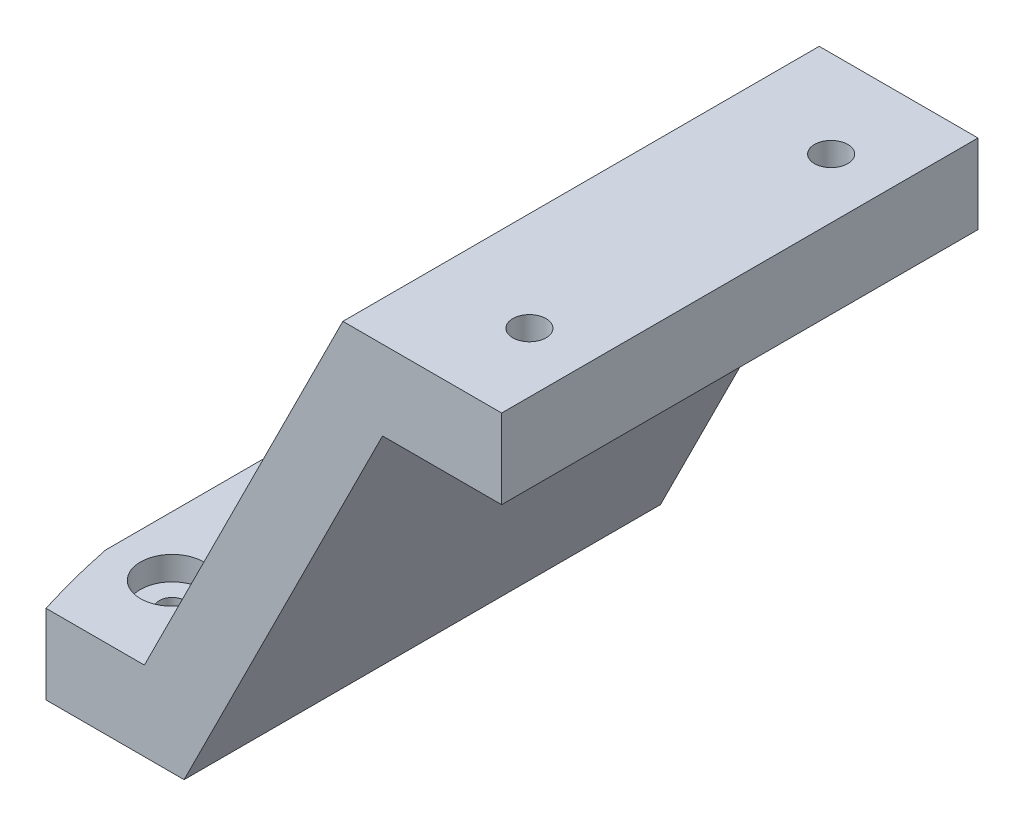
ISO-10303-21;
HEADER;
FILE_DESCRIPTION(('STEP AP214'),'2;1');
FILE_NAME('part.step','',(''),(''),'','','');
FILE_SCHEMA(('AUTOMOTIVE_DESIGN { 1 0 10303 214 1 1 1 1 }'));
ENDSEC;
DATA;
#1=APPLICATION_CONTEXT('core data for automotive mechanical design processes');
#2=APPLICATION_PROTOCOL_DEFINITION('international standard','automotive_design',2000,#1);
#3=PRODUCT_CONTEXT('',#1,'mechanical');
#4=PRODUCT('Part','Part','',(#3));
#5=PRODUCT_RELATED_PRODUCT_CATEGORY('part','',(#4));
#6=PRODUCT_DEFINITION_FORMATION('','',#4);
#7=PRODUCT_DEFINITION_CONTEXT('part definition',#1,'design');
#8=PRODUCT_DEFINITION('design','',#6,#7);
#9=PRODUCT_DEFINITION_SHAPE('','',#8);
#10=(LENGTH_UNIT() NAMED_UNIT(*) SI_UNIT(.MILLI.,.METRE.));
#11=(NAMED_UNIT(*) PLANE_ANGLE_UNIT() SI_UNIT($,.RADIAN.));
#12=(NAMED_UNIT(*) SI_UNIT($,.STERADIAN.) SOLID_ANGLE_UNIT());
#13=UNCERTAINTY_MEASURE_WITH_UNIT(LENGTH_MEASURE(1.E-05),#10,'distance_accuracy_value','');
#14=(GEOMETRIC_REPRESENTATION_CONTEXT(3) GLOBAL_UNCERTAINTY_ASSIGNED_CONTEXT((#13)) GLOBAL_UNIT_ASSIGNED_CONTEXT((#10,
#11,#12)) REPRESENTATION_CONTEXT('',''));
#15=CARTESIAN_POINT('',(0.,0.,0.));
#16=DIRECTION('',(0.,0.,1.));
#17=DIRECTION('',(1.,0.,0.));
#18=AXIS2_PLACEMENT_3D('',#15,#16,#17);
#19=CARTESIAN_POINT('',(-12.5,0.,11.));
#20=DIRECTION('',(0.,1.,0.));
#21=DIRECTION('',(0.,0.,1.));
#22=AXIS2_PLACEMENT_3D('',#19,#20,#21);
#23=CYLINDRICAL_SURFACE('',#22,1.6);
#24=CARTESIAN_POINT('',(-12.5,0.,11.));
#25=DIRECTION('',(0.,1.,0.));
#26=DIRECTION('',(0.,0.,1.));
#27=AXIS2_PLACEMENT_3D('',#24,#25,#26);
#28=CIRCLE('',#27,1.6);
#29=CARTESIAN_POINT('',(-12.5,0.,12.6));
#30=VERTEX_POINT('',#29);
#31=EDGE_CURVE('E300',#30,#30,#28,.T.);
#32=ORIENTED_EDGE('',*,*,#31,.F.);
#33=EDGE_LOOP('',(#32));
#34=FACE_BOUND('',#33,.T.);
#35=CARTESIAN_POINT('',(-12.5,7.,11.));
#36=DIRECTION('',(0.,1.,0.));
#37=DIRECTION('',(0.,0.,1.));
#38=AXIS2_PLACEMENT_3D('',#35,#36,#37);
#39=CIRCLE('',#38,1.6);
#40=CARTESIAN_POINT('',(-12.5,7.,12.6));
#41=VERTEX_POINT('',#40);
#42=EDGE_CURVE('E303',#41,#41,#39,.F.);
#43=ORIENTED_EDGE('',*,*,#42,.F.);
#44=EDGE_LOOP('',(#43));
#45=FACE_BOUND('',#44,.T.);
#46=ADVANCED_FACE('F33',(#34,#45),#23,.F.);
#47=CARTESIAN_POINT('',(-12.5,0.,49.));
#48=DIRECTION('',(0.,1.,0.));
#49=DIRECTION('',(0.,0.,1.));
#50=AXIS2_PLACEMENT_3D('',#47,#48,#49);
#51=CYLINDRICAL_SURFACE('',#50,1.6);
#52=CARTESIAN_POINT('',(-12.5,0.,49.));
#53=DIRECTION('',(0.,1.,0.));
#54=DIRECTION('',(0.,0.,1.));
#55=AXIS2_PLACEMENT_3D('',#52,#53,#54);
#56=CIRCLE('',#55,1.6);
#57=CARTESIAN_POINT('',(-12.5,0.,50.6));
#58=VERTEX_POINT('',#57);
#59=EDGE_CURVE('E296',#58,#58,#56,.T.);
#60=ORIENTED_EDGE('',*,*,#59,.F.);
#61=EDGE_LOOP('',(#60));
#62=FACE_BOUND('',#61,.T.);
#63=CARTESIAN_POINT('',(-12.5,7.,49.));
#64=DIRECTION('',(0.,1.,0.));
#65=DIRECTION('',(0.,0.,1.));
#66=AXIS2_PLACEMENT_3D('',#63,#64,#65);
#67=CIRCLE('',#66,1.6);
#68=CARTESIAN_POINT('',(-12.5,7.,50.6));
#69=VERTEX_POINT('',#68);
#70=EDGE_CURVE('E287',#69,#69,#67,.F.);
#71=ORIENTED_EDGE('',*,*,#70,.F.);
#72=EDGE_LOOP('',(#71));
#73=FACE_BOUND('',#72,.T.);
#74=ADVANCED_FACE('F457',(#62,#73),#51,.F.);
#75=CARTESIAN_POINT('',(-20.,10.,60.));
#76=DIRECTION('',(0.,-1.,0.));
#77=DIRECTION('',(0.,0.,-1.));
#78=AXIS2_PLACEMENT_3D('',#75,#76,#77);
#79=PLANE('',#78);
#80=CARTESIAN_POINT('',(-12.5,10.,49.));
#81=DIRECTION('',(0.,1.,0.));
#82=DIRECTION('',(0.,0.,1.));
#83=AXIS2_PLACEMENT_3D('',#80,#81,#82);
#84=CIRCLE('',#83,4.);
#85=CARTESIAN_POINT('',(-12.5,10.,53.));
#86=VERTEX_POINT('',#85);
#87=EDGE_CURVE('E288',#86,#86,#84,.T.);
#88=ORIENTED_EDGE('',*,*,#87,.F.);
#89=EDGE_LOOP('',(#88));
#90=FACE_BOUND('',#89,.T.);
#91=CARTESIAN_POINT('',(-12.5,10.,11.));
#92=DIRECTION('',(0.,1.,0.));
#93=DIRECTION('',(0.,0.,1.));
#94=AXIS2_PLACEMENT_3D('',#91,#92,#93);
#95=CIRCLE('',#94,4.);
#96=CARTESIAN_POINT('',(-12.5,10.,15.));
#97=VERTEX_POINT('',#96);
#98=EDGE_CURVE('E280',#97,#97,#95,.T.);
#99=ORIENTED_EDGE('',*,*,#98,.F.);
#100=EDGE_LOOP('',(#99));
#101=FACE_BOUND('',#100,.T.);
#102=CARTESIAN_POINT('',(78.,10.,30.));
#103=DIRECTION('',(0.,1.,0.));
#104=DIRECTION('',(0.,0.,1.));
#105=AXIS2_PLACEMENT_3D('',#102,#103,#104);
#106=CIRCLE('',#105,100.);
#107=CARTESIAN_POINT('',(-20.,10.,49.8997487421326));
#108=VERTEX_POINT('',#107);
#109=CARTESIAN_POINT('',(-17.3939201416946,10.,60.));
#110=VERTEX_POINT('',#109);
#111=EDGE_CURVE('E317',#108,#110,#106,.T.);
#112=ORIENTED_EDGE('',*,*,#111,.T.);
#113=DIRECTION('',(-1.,0.,0.));
#114=VECTOR('',#113,1.);
#115=CARTESIAN_POINT('',(-20.,10.,60.));
#116=LINE('',#115,#114);
#117=CARTESIAN_POINT('',(-5.,10.,60.));
#118=VERTEX_POINT('',#117);
#119=EDGE_CURVE('E353',#118,#110,#116,.T.);
#120=ORIENTED_EDGE('',*,*,#119,.F.);
#121=DIRECTION('',(0.,0.,-1.));
#122=VECTOR('',#121,1.);
#123=CARTESIAN_POINT('',(-5.,10.,60.));
#124=LINE('',#123,#122);
#125=CARTESIAN_POINT('',(-5.,10.,0.));
#126=VERTEX_POINT('',#125);
#127=EDGE_CURVE('E381',#118,#126,#124,.T.);
#128=ORIENTED_EDGE('',*,*,#127,.T.);
#129=DIRECTION('',(-1.,0.,0.));
#130=VECTOR('',#129,1.);
#131=CARTESIAN_POINT('',(-20.,10.,0.));
#132=LINE('',#131,#130);
#133=CARTESIAN_POINT('',(-17.3939201416946,10.,0.));
#134=VERTEX_POINT('',#133);
#135=EDGE_CURVE('E369',#126,#134,#132,.T.);
#136=ORIENTED_EDGE('',*,*,#135,.T.);
#137=CARTESIAN_POINT('',(-20.,10.,10.1002512578674));
#138=VERTEX_POINT('',#137);
#139=EDGE_CURVE('E328',#134,#138,#106,.T.);
#140=ORIENTED_EDGE('',*,*,#139,.T.);
#141=DIRECTION('',(0.,0.,-1.));
#142=VECTOR('',#141,1.);
#143=CARTESIAN_POINT('',(-20.,10.,60.));
#144=LINE('',#143,#142);
#145=EDGE_CURVE('E378',#108,#138,#144,.T.);
#146=ORIENTED_EDGE('',*,*,#145,.F.);
#147=EDGE_LOOP('',(#112,#120,#128,#136,#140,#146));
#148=FACE_BOUND('',#147,.T.);
#149=ADVANCED_FACE('F464',(#90,#101,#148),#79,.F.);
#150=CARTESIAN_POINT('',(-20.,0.,60.));
#151=DIRECTION('',(1.,0.,0.));
#152=DIRECTION('',(0.,0.,-1.));
#153=AXIS2_PLACEMENT_3D('',#150,#151,#152);
#154=PLANE('',#153);
#155=DIRECTION('',(0.,1.,0.));
#156=VECTOR('',#155,1.);
#157=CARTESIAN_POINT('',(-20.,-50.,10.1002512578674));
#158=LINE('',#157,#156);
#159=CARTESIAN_POINT('',(-20.,0.,10.1002512578674));
#160=VERTEX_POINT('',#159);
#161=EDGE_CURVE('E333',#160,#138,#158,.T.);
#162=ORIENTED_EDGE('',*,*,#161,.F.);
#163=DIRECTION('',(0.,0.,-1.));
#164=VECTOR('',#163,1.);
#165=CARTESIAN_POINT('',(-20.,0.,60.));
#166=LINE('',#165,#164);
#167=CARTESIAN_POINT('',(-20.,0.,49.8997487421326));
#168=VERTEX_POINT('',#167);
#169=EDGE_CURVE('E375',#168,#160,#166,.T.);
#170=ORIENTED_EDGE('',*,*,#169,.F.);
#171=DIRECTION('',(0.,1.,0.));
#172=VECTOR('',#171,1.);
#173=CARTESIAN_POINT('',(-20.,-50.,49.8997487421326));
#174=LINE('',#173,#172);
#175=EDGE_CURVE('E338',#108,#168,#174,.F.);
#176=ORIENTED_EDGE('',*,*,#175,.F.);
#177=ORIENTED_EDGE('',*,*,#145,.T.);
#178=EDGE_LOOP('',(#162,#170,#176,#177));
#179=FACE_BOUND('',#178,.T.);
#180=ADVANCED_FACE('F509',(#179),#154,.F.);
#181=CARTESIAN_POINT('',(0.,0.,60.));
#182=DIRECTION('',(0.,1.,0.));
#183=DIRECTION('',(-1.,0.,0.));
#184=AXIS2_PLACEMENT_3D('',#181,#182,#183);
#185=PLANE('',#184);
#186=ORIENTED_EDGE('',*,*,#59,.T.);
#187=EDGE_LOOP('',(#186));
#188=FACE_BOUND('',#187,.T.);
#189=ORIENTED_EDGE('',*,*,#31,.T.);
#190=EDGE_LOOP('',(#189));
#191=FACE_BOUND('',#190,.T.);
#192=CARTESIAN_POINT('',(78.,0.,30.));
#193=DIRECTION('',(0.,1.,0.));
#194=DIRECTION('',(-1.,0.,0.));
#195=AXIS2_PLACEMENT_3D('',#192,#193,#194);
#196=CIRCLE('',#195,100.);
#197=CARTESIAN_POINT('',(-17.3939201416946,0.,60.));
#198=VERTEX_POINT('',#197);
#199=EDGE_CURVE('E334',#168,#198,#196,.T.);
#200=ORIENTED_EDGE('',*,*,#199,.F.);
#201=ORIENTED_EDGE('',*,*,#169,.T.);
#202=CARTESIAN_POINT('',(-17.3939201416946,0.,0.));
#203=VERTEX_POINT('',#202);
#204=EDGE_CURVE('E331',#203,#160,#196,.T.);
#205=ORIENTED_EDGE('',*,*,#204,.F.);
#206=DIRECTION('',(1.,0.,0.));
#207=VECTOR('',#206,1.);
#208=CARTESIAN_POINT('',(0.,0.,0.));
#209=LINE('',#208,#207);
#210=CARTESIAN_POINT('',(0.,0.,0.));
#211=VERTEX_POINT('',#210);
#212=EDGE_CURVE('E345',#203,#211,#209,.T.);
#213=ORIENTED_EDGE('',*,*,#212,.T.);
#214=DIRECTION('',(0.,0.,-1.));
#215=VECTOR('',#214,1.);
#216=CARTESIAN_POINT('',(0.,0.,60.));
#217=LINE('',#216,#215);
#218=CARTESIAN_POINT('',(0.,0.,60.));
#219=VERTEX_POINT('',#218);
#220=EDGE_CURVE('E358',#219,#211,#217,.T.);
#221=ORIENTED_EDGE('',*,*,#220,.F.);
#222=DIRECTION('',(1.,0.,0.));
#223=VECTOR('',#222,1.);
#224=CARTESIAN_POINT('',(0.,0.,60.));
#225=LINE('',#224,#223);
#226=EDGE_CURVE('E356',#198,#219,#225,.T.);
#227=ORIENTED_EDGE('',*,*,#226,.F.);
#228=EDGE_LOOP('',(#200,#201,#205,#213,#221,#227));
#229=FACE_BOUND('',#228,.T.);
#230=ADVANCED_FACE('F501',(#188,#191,#229),#185,.F.);
#231=CARTESIAN_POINT('',(0.,0.,60.));
#232=DIRECTION('',(0.,0.,-1.));
#233=DIRECTION('',(-1.,0.,0.));
#234=AXIS2_PLACEMENT_3D('',#231,#232,#233);
#235=PLANE('',#234);
#236=DIRECTION('',(0.,1.,0.));
#237=VECTOR('',#236,1.);
#238=CARTESIAN_POINT('',(-17.3939201416946,-50.,60.));
#239=LINE('',#238,#237);
#240=EDGE_CURVE('E336',#198,#110,#239,.T.);
#241=ORIENTED_EDGE('',*,*,#240,.F.);
#242=ORIENTED_EDGE('',*,*,#226,.T.);
#243=DIRECTION('',(0.447213595499958,0.894427190999916,0.));
#244=VECTOR('',#243,1.);
#245=CARTESIAN_POINT('',(25.,50.,60.));
#246=LINE('',#245,#244);
#247=CARTESIAN_POINT('',(25.,50.,60.));
#248=VERTEX_POINT('',#247);
#249=EDGE_CURVE('E341',#219,#248,#246,.T.);
#250=ORIENTED_EDGE('',*,*,#249,.T.);
#251=DIRECTION('',(1.,0.,0.));
#252=VECTOR('',#251,1.);
#253=CARTESIAN_POINT('',(40.,50.,60.));
#254=LINE('',#253,#252);
#255=CARTESIAN_POINT('',(40.,50.,60.));
#256=VERTEX_POINT('',#255);
#257=EDGE_CURVE('E344',#248,#256,#254,.T.);
#258=ORIENTED_EDGE('',*,*,#257,.T.);
#259=DIRECTION('',(0.,1.,0.));
#260=VECTOR('',#259,1.);
#261=CARTESIAN_POINT('',(40.,60.,60.));
#262=LINE('',#261,#260);
#263=CARTESIAN_POINT('',(40.,60.,60.));
#264=VERTEX_POINT('',#263);
#265=EDGE_CURVE('E347',#256,#264,#262,.T.);
#266=ORIENTED_EDGE('',*,*,#265,.T.);
#267=DIRECTION('',(-1.,0.,0.));
#268=VECTOR('',#267,1.);
#269=CARTESIAN_POINT('',(20.,60.,60.));
#270=LINE('',#269,#268);
#271=CARTESIAN_POINT('',(20.,60.,60.));
#272=VERTEX_POINT('',#271);
#273=EDGE_CURVE('E349',#264,#272,#270,.T.);
#274=ORIENTED_EDGE('',*,*,#273,.T.);
#275=DIRECTION('',(-0.447213595499958,-0.894427190999916,0.));
#276=VECTOR('',#275,1.);
#277=CARTESIAN_POINT('',(-5.,10.,60.));
#278=LINE('',#277,#276);
#279=EDGE_CURVE('E351',#272,#118,#278,.T.);
#280=ORIENTED_EDGE('',*,*,#279,.T.);
#281=ORIENTED_EDGE('',*,*,#119,.T.);
#282=EDGE_LOOP('',(#241,#242,#250,#258,#266,#274,#280,#281));
#283=FACE_BOUND('',#282,.T.);
#284=ADVANCED_FACE('F497',(#283),#235,.F.);
#285=CARTESIAN_POINT('',(0.,0.,0.));
#286=DIRECTION('',(0.,0.,-1.));
#287=DIRECTION('',(-1.,0.,0.));
#288=AXIS2_PLACEMENT_3D('',#285,#286,#287);
#289=PLANE('',#288);
#290=ORIENTED_EDGE('',*,*,#212,.F.);
#291=DIRECTION('',(0.,1.,0.));
#292=VECTOR('',#291,1.);
#293=CARTESIAN_POINT('',(-17.3939201416946,-50.,0.));
#294=LINE('',#293,#292);
#295=EDGE_CURVE('E396',#203,#134,#294,.T.);
#296=ORIENTED_EDGE('',*,*,#295,.T.);
#297=ORIENTED_EDGE('',*,*,#135,.F.);
#298=DIRECTION('',(-0.447213595499958,-0.894427190999916,0.));
#299=VECTOR('',#298,1.);
#300=CARTESIAN_POINT('',(-5.,10.,0.));
#301=LINE('',#300,#299);
#302=CARTESIAN_POINT('',(20.,60.,0.));
#303=VERTEX_POINT('',#302);
#304=EDGE_CURVE('E367',#303,#126,#301,.T.);
#305=ORIENTED_EDGE('',*,*,#304,.F.);
#306=DIRECTION('',(-1.,0.,0.));
#307=VECTOR('',#306,1.);
#308=CARTESIAN_POINT('',(20.,60.,0.));
#309=LINE('',#308,#307);
#310=CARTESIAN_POINT('',(40.,60.,0.));
#311=VERTEX_POINT('',#310);
#312=EDGE_CURVE('E365',#311,#303,#309,.T.);
#313=ORIENTED_EDGE('',*,*,#312,.F.);
#314=DIRECTION('',(0.,1.,0.));
#315=VECTOR('',#314,1.);
#316=CARTESIAN_POINT('',(40.,60.,0.));
#317=LINE('',#316,#315);
#318=CARTESIAN_POINT('',(40.,50.,0.));
#319=VERTEX_POINT('',#318);
#320=EDGE_CURVE('E363',#319,#311,#317,.T.);
#321=ORIENTED_EDGE('',*,*,#320,.F.);
#322=DIRECTION('',(1.,0.,0.));
#323=VECTOR('',#322,1.);
#324=CARTESIAN_POINT('',(40.,50.,0.));
#325=LINE('',#324,#323);
#326=CARTESIAN_POINT('',(25.,50.,0.));
#327=VERTEX_POINT('',#326);
#328=EDGE_CURVE('E361',#327,#319,#325,.T.);
#329=ORIENTED_EDGE('',*,*,#328,.F.);
#330=DIRECTION('',(0.447213595499958,0.894427190999916,0.));
#331=VECTOR('',#330,1.);
#332=CARTESIAN_POINT('',(25.,50.,0.));
#333=LINE('',#332,#331);
#334=EDGE_CURVE('E340',#211,#327,#333,.T.);
#335=ORIENTED_EDGE('',*,*,#334,.F.);
#336=EDGE_LOOP('',(#290,#296,#297,#305,#313,#321,#329,#335));
#337=FACE_BOUND('',#336,.T.);
#338=ADVANCED_FACE('F500',(#337),#289,.T.);
#339=CARTESIAN_POINT('',(25.,50.,60.));
#340=DIRECTION('',(-0.894427190999916,0.447213595499958,0.));
#341=DIRECTION('',(-0.447213595499958,-0.894427190999916,0.));
#342=AXIS2_PLACEMENT_3D('',#339,#340,#341);
#343=PLANE('',#342);
#344=ORIENTED_EDGE('',*,*,#334,.T.);
#345=DIRECTION('',(0.,0.,-1.));
#346=VECTOR('',#345,1.);
#347=CARTESIAN_POINT('',(25.,50.,60.));
#348=LINE('',#347,#346);
#349=EDGE_CURVE('E393',#248,#327,#348,.T.);
#350=ORIENTED_EDGE('',*,*,#349,.F.);
#351=ORIENTED_EDGE('',*,*,#249,.F.);
#352=ORIENTED_EDGE('',*,*,#220,.T.);
#353=EDGE_LOOP('',(#344,#350,#351,#352));
#354=FACE_BOUND('',#353,.T.);
#355=ADVANCED_FACE('F505',(#354),#343,.F.);
#356=CARTESIAN_POINT('',(40.,50.,60.));
#357=DIRECTION('',(0.,1.,0.));
#358=DIRECTION('',(0.,0.,1.));
#359=AXIS2_PLACEMENT_3D('',#356,#357,#358);
#360=PLANE('',#359);
#361=DIRECTION('',(1.,0.,0.));
#362=VECTOR('',#361,1.);
#363=CARTESIAN_POINT('',(36.1,50.,7.4));
#364=LINE('',#363,#362);
#365=CARTESIAN_POINT('',(28.9,50.,7.4));
#366=VERTEX_POINT('',#365);
#367=CARTESIAN_POINT('',(36.1,50.,7.4));
#368=VERTEX_POINT('',#367);
#369=EDGE_CURVE('E237',#366,#368,#364,.T.);
#370=ORIENTED_EDGE('',*,*,#369,.F.);
#371=DIRECTION('',(0.,0.,-1.));
#372=VECTOR('',#371,1.);
#373=CARTESIAN_POINT('',(28.9,50.,14.6));
#374=LINE('',#373,#372);
#375=CARTESIAN_POINT('',(28.9,50.,14.6));
#376=VERTEX_POINT('',#375);
#377=EDGE_CURVE('E50',#376,#366,#374,.T.);
#378=ORIENTED_EDGE('',*,*,#377,.F.);
#379=DIRECTION('',(-1.,0.,0.));
#380=VECTOR('',#379,1.);
#381=CARTESIAN_POINT('',(36.1,50.,14.6));
#382=LINE('',#381,#380);
#383=CARTESIAN_POINT('',(36.1,50.,14.6));
#384=VERTEX_POINT('',#383);
#385=EDGE_CURVE('E228',#384,#376,#382,.T.);
#386=ORIENTED_EDGE('',*,*,#385,.F.);
#387=DIRECTION('',(0.,0.,1.));
#388=VECTOR('',#387,1.);
#389=CARTESIAN_POINT('',(36.1,50.,14.6));
#390=LINE('',#389,#388);
#391=EDGE_CURVE('E231',#368,#384,#390,.T.);
#392=ORIENTED_EDGE('',*,*,#391,.F.);
#393=EDGE_LOOP('',(#370,#378,#386,#392));
#394=FACE_BOUND('',#393,.T.);
#395=DIRECTION('',(1.,0.,0.));
#396=VECTOR('',#395,1.);
#397=CARTESIAN_POINT('',(36.1,50.,45.4));
#398=LINE('',#397,#396);
#399=CARTESIAN_POINT('',(28.9,50.,45.4));
#400=VERTEX_POINT('',#399);
#401=CARTESIAN_POINT('',(36.1,50.,45.4));
#402=VERTEX_POINT('',#401);
#403=EDGE_CURVE('E263',#400,#402,#398,.T.);
#404=ORIENTED_EDGE('',*,*,#403,.F.);
#405=DIRECTION('',(0.,0.,-1.));
#406=VECTOR('',#405,1.);
#407=CARTESIAN_POINT('',(28.9,50.,52.6));
#408=LINE('',#407,#406);
#409=CARTESIAN_POINT('',(28.9,50.,52.6));
#410=VERTEX_POINT('',#409);
#411=EDGE_CURVE('E58',#410,#400,#408,.T.);
#412=ORIENTED_EDGE('',*,*,#411,.F.);
#413=DIRECTION('',(-1.,0.,0.));
#414=VECTOR('',#413,1.);
#415=CARTESIAN_POINT('',(36.1,50.,52.6));
#416=LINE('',#415,#414);
#417=CARTESIAN_POINT('',(36.1,50.,52.6));
#418=VERTEX_POINT('',#417);
#419=EDGE_CURVE('E252',#418,#410,#416,.T.);
#420=ORIENTED_EDGE('',*,*,#419,.F.);
#421=DIRECTION('',(0.,0.,1.));
#422=VECTOR('',#421,1.);
#423=CARTESIAN_POINT('',(36.1,50.,52.6));
#424=LINE('',#423,#422);
#425=EDGE_CURVE('E266',#402,#418,#424,.T.);
#426=ORIENTED_EDGE('',*,*,#425,.F.);
#427=EDGE_LOOP('',(#404,#412,#420,#426));
#428=FACE_BOUND('',#427,.T.);
#429=ORIENTED_EDGE('',*,*,#328,.T.);
#430=DIRECTION('',(0.,0.,-1.));
#431=VECTOR('',#430,1.);
#432=CARTESIAN_POINT('',(40.,50.,60.));
#433=LINE('',#432,#431);
#434=EDGE_CURVE('E390',#256,#319,#433,.T.);
#435=ORIENTED_EDGE('',*,*,#434,.F.);
#436=ORIENTED_EDGE('',*,*,#257,.F.);
#437=ORIENTED_EDGE('',*,*,#349,.T.);
#438=EDGE_LOOP('',(#429,#435,#436,#437));
#439=FACE_BOUND('',#438,.T.);
#440=ADVANCED_FACE('F528',(#394,#428,#439),#360,.F.);
#441=CARTESIAN_POINT('',(40.,60.,60.));
#442=DIRECTION('',(-1.,0.,0.));
#443=DIRECTION('',(0.,0.,1.));
#444=AXIS2_PLACEMENT_3D('',#441,#442,#443);
#445=PLANE('',#444);
#446=ORIENTED_EDGE('',*,*,#320,.T.);
#447=DIRECTION('',(0.,0.,-1.));
#448=VECTOR('',#447,1.);
#449=CARTESIAN_POINT('',(40.,60.,60.));
#450=LINE('',#449,#448);
#451=EDGE_CURVE('E387',#264,#311,#450,.T.);
#452=ORIENTED_EDGE('',*,*,#451,.F.);
#453=ORIENTED_EDGE('',*,*,#265,.F.);
#454=ORIENTED_EDGE('',*,*,#434,.T.);
#455=EDGE_LOOP('',(#446,#452,#453,#454));
#456=FACE_BOUND('',#455,.T.);
#457=ADVANCED_FACE('F524',(#456),#445,.F.);
#458=CARTESIAN_POINT('',(20.,60.,60.));
#459=DIRECTION('',(0.,-1.,0.));
#460=DIRECTION('',(1.,0.,0.));
#461=AXIS2_PLACEMENT_3D('',#458,#459,#460);
#462=PLANE('',#461);
#463=CARTESIAN_POINT('',(32.5,60.,49.));
#464=DIRECTION('',(0.,-1.,0.));
#465=DIRECTION('',(0.,0.,-1.));
#466=AXIS2_PLACEMENT_3D('',#463,#464,#465);
#467=CIRCLE('',#466,2.1);
#468=CARTESIAN_POINT('',(32.5,60.,46.9));
#469=VERTEX_POINT('',#468);
#470=EDGE_CURVE('E277',#469,#469,#467,.T.);
#471=ORIENTED_EDGE('',*,*,#470,.T.);
#472=EDGE_LOOP('',(#471));
#473=FACE_BOUND('',#472,.T.);
#474=CARTESIAN_POINT('',(32.5,60.,11.));
#475=DIRECTION('',(0.,-1.,0.));
#476=DIRECTION('',(0.,0.,-1.));
#477=AXIS2_PLACEMENT_3D('',#474,#475,#476);
#478=CIRCLE('',#477,2.1);
#479=CARTESIAN_POINT('',(32.5,60.,8.9));
#480=VERTEX_POINT('',#479);
#481=EDGE_CURVE('E281',#480,#480,#478,.T.);
#482=ORIENTED_EDGE('',*,*,#481,.T.);
#483=EDGE_LOOP('',(#482));
#484=FACE_BOUND('',#483,.T.);
#485=ORIENTED_EDGE('',*,*,#312,.T.);
#486=DIRECTION('',(0.,0.,-1.));
#487=VECTOR('',#486,1.);
#488=CARTESIAN_POINT('',(20.,60.,60.));
#489=LINE('',#488,#487);
#490=EDGE_CURVE('E384',#272,#303,#489,.T.);
#491=ORIENTED_EDGE('',*,*,#490,.F.);
#492=ORIENTED_EDGE('',*,*,#273,.F.);
#493=ORIENTED_EDGE('',*,*,#451,.T.);
#494=EDGE_LOOP('',(#485,#491,#492,#493));
#495=FACE_BOUND('',#494,.T.);
#496=ADVANCED_FACE('F520',(#473,#484,#495),#462,.F.);
#497=CARTESIAN_POINT('',(-5.,10.,60.));
#498=DIRECTION('',(0.894427190999916,-0.447213595499958,0.));
#499=DIRECTION('',(0.447213595499958,0.894427190999916,0.));
#500=AXIS2_PLACEMENT_3D('',#497,#498,#499);
#501=PLANE('',#500);
#502=DIRECTION('',(0.,0.,-1.));
#503=VECTOR('',#502,1.);
#504=CARTESIAN_POINT('',(16.4442719099992,52.8885438199983,9.99999999999999));
#505=LINE('',#504,#503);
#506=CARTESIAN_POINT('',(16.4442719099992,52.8885438199983,45.));
#507=VERTEX_POINT('',#506);
#508=CARTESIAN_POINT('',(16.4442719099992,52.8885438199983,15.));
#509=VERTEX_POINT('',#508);
#510=EDGE_CURVE('E320',#507,#509,#505,.T.);
#511=ORIENTED_EDGE('',*,*,#510,.F.);
#512=CARTESIAN_POINT('',(14.2082039324994,48.4164078649987,45.));
#513=DIRECTION('',(0.894427190999916,-0.447213595499958,0.));
#514=DIRECTION('',(0.447213595499958,0.894427190999916,0.));
#515=AXIS2_PLACEMENT_3D('',#512,#513,#514);
#516=CIRCLE('',#515,5.);
#517=CARTESIAN_POINT('',(14.2082039324994,48.4164078649988,50.));
#518=VERTEX_POINT('',#517);
#519=EDGE_CURVE('E42',#507,#518,#516,.T.);
#520=ORIENTED_EDGE('',*,*,#519,.T.);
#521=DIRECTION('',(0.447213595499958,0.894427190999916,0.));
#522=VECTOR('',#521,1.);
#523=CARTESIAN_POINT('',(-1.44427190999916,17.1114561800017,50.));
#524=LINE('',#523,#522);
#525=CARTESIAN_POINT('',(0.79179606750063,21.5835921350013,50.));
#526=VERTEX_POINT('',#525);
#527=EDGE_CURVE('E299',#526,#518,#524,.T.);
#528=ORIENTED_EDGE('',*,*,#527,.F.);
#529=CARTESIAN_POINT('',(0.791796067500631,21.5835921350013,45.));
#530=DIRECTION('',(0.894427190999916,-0.447213595499958,0.));
#531=DIRECTION('',(0.447213595499958,0.894427190999916,0.));
#532=AXIS2_PLACEMENT_3D('',#529,#530,#531);
#533=CIRCLE('',#532,5.);
#534=CARTESIAN_POINT('',(-1.44427190999916,17.1114561800017,45.));
#535=VERTEX_POINT('',#534);
#536=EDGE_CURVE('E427',#526,#535,#533,.T.);
#537=ORIENTED_EDGE('',*,*,#536,.T.);
#538=DIRECTION('',(0.,0.,1.));
#539=VECTOR('',#538,1.);
#540=CARTESIAN_POINT('',(-1.44427190999916,17.1114561800017,9.99999999999999));
#541=LINE('',#540,#539);
#542=CARTESIAN_POINT('',(-1.44427190999916,17.1114561800017,15.));
#543=VERTEX_POINT('',#542);
#544=EDGE_CURVE('E308',#543,#535,#541,.T.);
#545=ORIENTED_EDGE('',*,*,#544,.F.);
#546=CARTESIAN_POINT('',(0.791796067500632,21.5835921350013,15.));
#547=DIRECTION('',(0.894427190999916,-0.447213595499958,0.));
#548=DIRECTION('',(0.447213595499958,0.894427190999916,0.));
#549=AXIS2_PLACEMENT_3D('',#546,#547,#548);
#550=CIRCLE('',#549,5.);
#551=CARTESIAN_POINT('',(0.79179606750063,21.5835921350013,9.99999999999999));
#552=VERTEX_POINT('',#551);
#553=EDGE_CURVE('E429',#543,#552,#550,.T.);
#554=ORIENTED_EDGE('',*,*,#553,.T.);
#555=DIRECTION('',(-0.447213595499958,-0.894427190999916,0.));
#556=VECTOR('',#555,1.);
#557=CARTESIAN_POINT('',(-1.44427190999916,17.1114561800017,9.99999999999999));
#558=LINE('',#557,#556);
#559=CARTESIAN_POINT('',(14.2082039324994,48.4164078649988,9.99999999999999));
#560=VERTEX_POINT('',#559);
#561=EDGE_CURVE('E323',#560,#552,#558,.T.);
#562=ORIENTED_EDGE('',*,*,#561,.F.);
#563=CARTESIAN_POINT('',(14.2082039324994,48.4164078649987,15.));
#564=DIRECTION('',(0.894427190999916,-0.447213595499958,0.));
#565=DIRECTION('',(0.447213595499958,0.894427190999916,0.));
#566=AXIS2_PLACEMENT_3D('',#563,#564,#565);
#567=CIRCLE('',#566,5.);
#568=EDGE_CURVE('E11',#560,#509,#567,.T.);
#569=ORIENTED_EDGE('',*,*,#568,.T.);
#570=EDGE_LOOP('',(#511,#520,#528,#537,#545,#554,#562,#569));
#571=FACE_BOUND('',#570,.T.);
#572=ORIENTED_EDGE('',*,*,#304,.T.);
#573=ORIENTED_EDGE('',*,*,#127,.F.);
#574=ORIENTED_EDGE('',*,*,#279,.F.);
#575=ORIENTED_EDGE('',*,*,#490,.T.);
#576=EDGE_LOOP('',(#572,#573,#574,#575));
#577=FACE_BOUND('',#576,.T.);
#578=ADVANCED_FACE('F517',(#571,#577),#501,.F.);
#579=CARTESIAN_POINT('',(78.,-50.,30.));
#580=DIRECTION('',(0.,1.,0.));
#581=DIRECTION('',(0.,0.,1.));
#582=AXIS2_PLACEMENT_3D('',#579,#580,#581);
#583=CYLINDRICAL_SURFACE('',#582,100.);
#584=ORIENTED_EDGE('',*,*,#161,.T.);
#585=ORIENTED_EDGE('',*,*,#139,.F.);
#586=ORIENTED_EDGE('',*,*,#295,.F.);
#587=ORIENTED_EDGE('',*,*,#204,.T.);
#588=EDGE_LOOP('',(#584,#585,#586,#587));
#589=FACE_BOUND('',#588,.T.);
#590=ADVANCED_FACE('F495',(#589),#583,.T.);
#591=ORIENTED_EDGE('',*,*,#175,.T.);
#592=ORIENTED_EDGE('',*,*,#199,.T.);
#593=ORIENTED_EDGE('',*,*,#240,.T.);
#594=ORIENTED_EDGE('',*,*,#111,.F.);
#595=EDGE_LOOP('',(#591,#592,#593,#594));
#596=FACE_BOUND('',#595,.T.);
#597=ADVANCED_FACE('F491',(#596),#583,.T.);
#598=CARTESIAN_POINT('',(3.02786404500042,14.8753882025019,50.));
#599=DIRECTION('',(0.,0.,1.));
#600=DIRECTION('',(1.,0.,0.));
#601=AXIS2_PLACEMENT_3D('',#598,#599,#600);
#602=PLANE('',#601);
#603=DIRECTION('',(0.447213595499958,0.894427190999916,0.));
#604=VECTOR('',#603,1.);
#605=CARTESIAN_POINT('',(3.02786404500042,14.8753882025019,50.));
#606=LINE('',#605,#604);
#607=CARTESIAN_POINT('',(5.26393202250021,19.3475241575015,50.));
#608=VERTEX_POINT('',#607);
#609=CARTESIAN_POINT('',(18.6803398874989,46.180339887499,50.));
#610=VERTEX_POINT('',#609);
#611=EDGE_CURVE('E304',#608,#610,#606,.T.);
#612=ORIENTED_EDGE('',*,*,#611,.F.);
#613=DIRECTION('',(-0.894427190999916,0.447213595499958,0.));
#614=VECTOR('',#613,1.);
#615=CARTESIAN_POINT('',(0.79179606750063,21.5835921350013,50.));
#616=LINE('',#615,#614);
#617=EDGE_CURVE('E401',#608,#526,#616,.T.);
#618=ORIENTED_EDGE('',*,*,#617,.T.);
#619=ORIENTED_EDGE('',*,*,#527,.T.);
#620=DIRECTION('',(-0.894427190999916,0.447213595499958,0.));
#621=VECTOR('',#620,1.);
#622=CARTESIAN_POINT('',(18.6803398874989,46.180339887499,50.));
#623=LINE('',#622,#621);
#624=EDGE_CURVE('E399',#518,#610,#623,.F.);
#625=ORIENTED_EDGE('',*,*,#624,.T.);
#626=EDGE_LOOP('',(#612,#618,#619,#625));
#627=FACE_BOUND('',#626,.T.);
#628=ADVANCED_FACE('F481',(#627),#602,.F.);
#629=CARTESIAN_POINT('',(3.02786404500042,14.8753882025019,9.99999999999999));
#630=DIRECTION('',(-0.447213595499958,-0.894427190999916,0.));
#631=DIRECTION('',(0.894427190999916,-0.447213595499958,0.));
#632=AXIS2_PLACEMENT_3D('',#629,#630,#631);
#633=PLANE('',#632);
#634=ORIENTED_EDGE('',*,*,#544,.T.);
#635=DIRECTION('',(-0.894427190999916,0.447213595499958,0.));
#636=VECTOR('',#635,1.);
#637=CARTESIAN_POINT('',(3.02786404500042,14.8753882025019,45.));
#638=LINE('',#637,#636);
#639=CARTESIAN_POINT('',(3.02786404500042,14.8753882025019,45.));
#640=VERTEX_POINT('',#639);
#641=EDGE_CURVE('E407',#535,#640,#638,.F.);
#642=ORIENTED_EDGE('',*,*,#641,.T.);
#643=DIRECTION('',(0.,0.,1.));
#644=VECTOR('',#643,1.);
#645=CARTESIAN_POINT('',(3.02786404500042,14.8753882025019,9.99999999999999));
#646=LINE('',#645,#644);
#647=CARTESIAN_POINT('',(3.02786404500042,14.8753882025019,15.));
#648=VERTEX_POINT('',#647);
#649=EDGE_CURVE('E314',#648,#640,#646,.T.);
#650=ORIENTED_EDGE('',*,*,#649,.F.);
#651=DIRECTION('',(-0.894427190999916,0.447213595499958,0.));
#652=VECTOR('',#651,1.);
#653=CARTESIAN_POINT('',(-1.44427190999916,17.1114561800017,15.));
#654=LINE('',#653,#652);
#655=EDGE_CURVE('E404',#648,#543,#654,.T.);
#656=ORIENTED_EDGE('',*,*,#655,.T.);
#657=EDGE_LOOP('',(#634,#642,#650,#656));
#658=FACE_BOUND('',#657,.T.);
#659=ADVANCED_FACE('F477',(#658),#633,.F.);
#660=CARTESIAN_POINT('',(3.02786404500042,14.8753882025019,9.99999999999999));
#661=DIRECTION('',(0.,0.,-1.));
#662=DIRECTION('',(-1.,0.,0.));
#663=AXIS2_PLACEMENT_3D('',#660,#661,#662);
#664=PLANE('',#663);
#665=ORIENTED_EDGE('',*,*,#561,.T.);
#666=DIRECTION('',(-0.894427190999916,0.447213595499958,0.));
#667=VECTOR('',#666,1.);
#668=CARTESIAN_POINT('',(5.26393202250021,19.3475241575015,9.99999999999999));
#669=LINE('',#668,#667);
#670=CARTESIAN_POINT('',(5.26393202250021,19.3475241575015,9.99999999999999));
#671=VERTEX_POINT('',#670);
#672=EDGE_CURVE('E420',#552,#671,#669,.F.);
#673=ORIENTED_EDGE('',*,*,#672,.T.);
#674=DIRECTION('',(-0.447213595499958,-0.894427190999916,0.));
#675=VECTOR('',#674,1.);
#676=CARTESIAN_POINT('',(3.02786404500042,14.8753882025019,9.99999999999999));
#677=LINE('',#676,#675);
#678=CARTESIAN_POINT('',(18.6803398874989,46.180339887499,9.99999999999999));
#679=VERTEX_POINT('',#678);
#680=EDGE_CURVE('E311',#679,#671,#677,.T.);
#681=ORIENTED_EDGE('',*,*,#680,.F.);
#682=DIRECTION('',(-0.894427190999916,0.447213595499958,0.));
#683=VECTOR('',#682,1.);
#684=CARTESIAN_POINT('',(14.2082039324994,48.4164078649987,9.99999999999999));
#685=LINE('',#684,#683);
#686=EDGE_CURVE('E417',#679,#560,#685,.T.);
#687=ORIENTED_EDGE('',*,*,#686,.T.);
#688=EDGE_LOOP('',(#665,#673,#681,#687));
#689=FACE_BOUND('',#688,.T.);
#690=ADVANCED_FACE('F480',(#689),#664,.F.);
#691=CARTESIAN_POINT('',(20.9164078649987,50.6524758424985,9.99999999999999));
#692=DIRECTION('',(0.447213595499958,0.894427190999916,0.));
#693=DIRECTION('',(-0.894427190999916,0.447213595499958,0.));
#694=AXIS2_PLACEMENT_3D('',#691,#692,#693);
#695=PLANE('',#694);
#696=DIRECTION('',(0.,0.,-1.));
#697=VECTOR('',#696,1.);
#698=CARTESIAN_POINT('',(20.9164078649987,50.6524758424985,9.99999999999999));
#699=LINE('',#698,#697);
#700=CARTESIAN_POINT('',(20.9164078649987,50.6524758424985,45.));
#701=VERTEX_POINT('',#700);
#702=CARTESIAN_POINT('',(20.9164078649987,50.6524758424985,15.));
#703=VERTEX_POINT('',#702);
#704=EDGE_CURVE('E307',#701,#703,#699,.T.);
#705=ORIENTED_EDGE('',*,*,#704,.F.);
#706=DIRECTION('',(-0.894427190999916,0.447213595499958,0.));
#707=VECTOR('',#706,1.);
#708=CARTESIAN_POINT('',(16.4442719099992,52.8885438199983,45.));
#709=LINE('',#708,#707);
#710=EDGE_CURVE('E424',#701,#507,#709,.T.);
#711=ORIENTED_EDGE('',*,*,#710,.T.);
#712=ORIENTED_EDGE('',*,*,#510,.T.);
#713=DIRECTION('',(-0.894427190999916,0.447213595499958,0.));
#714=VECTOR('',#713,1.);
#715=CARTESIAN_POINT('',(20.9164078649987,50.6524758424985,15.));
#716=LINE('',#715,#714);
#717=EDGE_CURVE('E422',#509,#703,#716,.F.);
#718=ORIENTED_EDGE('',*,*,#717,.T.);
#719=EDGE_LOOP('',(#705,#711,#712,#718));
#720=FACE_BOUND('',#719,.T.);
#721=ADVANCED_FACE('F475',(#720),#695,.F.);
#722=CARTESIAN_POINT('',(-3.52786404500042,1.76393202250021,0.));
#723=DIRECTION('',(0.894427190999916,-0.447213595499958,0.));
#724=DIRECTION('',(0.447213595499958,0.894427190999916,0.));
#725=AXIS2_PLACEMENT_3D('',#722,#723,#724);
#726=PLANE('',#725);
#727=ORIENTED_EDGE('',*,*,#649,.T.);
#728=CARTESIAN_POINT('',(5.26393202250021,19.3475241575015,45.));
#729=DIRECTION('',(0.894427190999916,-0.447213595499958,0.));
#730=DIRECTION('',(0.447213595499958,0.894427190999916,0.));
#731=AXIS2_PLACEMENT_3D('',#728,#729,#730);
#732=CIRCLE('',#731,5.);
#733=EDGE_CURVE('E415',#640,#608,#732,.F.);
#734=ORIENTED_EDGE('',*,*,#733,.T.);
#735=ORIENTED_EDGE('',*,*,#611,.T.);
#736=CARTESIAN_POINT('',(18.6803398874989,46.180339887499,45.));
#737=DIRECTION('',(0.894427190999916,-0.447213595499958,0.));
#738=DIRECTION('',(0.447213595499958,0.894427190999916,0.));
#739=AXIS2_PLACEMENT_3D('',#736,#737,#738);
#740=CIRCLE('',#739,5.);
#741=EDGE_CURVE('E411',#610,#701,#740,.F.);
#742=ORIENTED_EDGE('',*,*,#741,.T.);
#743=ORIENTED_EDGE('',*,*,#704,.T.);
#744=CARTESIAN_POINT('',(18.6803398874989,46.180339887499,15.));
#745=DIRECTION('',(0.894427190999916,-0.447213595499958,0.));
#746=DIRECTION('',(0.447213595499958,0.894427190999916,0.));
#747=AXIS2_PLACEMENT_3D('',#744,#745,#746);
#748=CIRCLE('',#747,5.);
#749=EDGE_CURVE('E409',#703,#679,#748,.F.);
#750=ORIENTED_EDGE('',*,*,#749,.T.);
#751=ORIENTED_EDGE('',*,*,#680,.T.);
#752=CARTESIAN_POINT('',(5.26393202250021,19.3475241575015,15.));
#753=DIRECTION('',(0.894427190999916,-0.447213595499958,0.));
#754=DIRECTION('',(0.447213595499958,0.894427190999916,0.));
#755=AXIS2_PLACEMENT_3D('',#752,#753,#754);
#756=CIRCLE('',#755,5.);
#757=EDGE_CURVE('E413',#671,#648,#756,.F.);
#758=ORIENTED_EDGE('',*,*,#757,.T.);
#759=EDGE_LOOP('',(#727,#734,#735,#742,#743,#750,#751,#758));
#760=FACE_BOUND('',#759,.T.);
#761=ADVANCED_FACE('F471',(#760),#726,.F.);
#762=CARTESIAN_POINT('',(5.26393202250021,19.3475241575015,45.));
#763=DIRECTION('',(0.894427190999916,-0.447213595499958,0.));
#764=DIRECTION('',(0.447213595499958,0.894427190999916,0.));
#765=AXIS2_PLACEMENT_3D('',#762,#763,#764);
#766=CYLINDRICAL_SURFACE('',#765,5.);
#767=ORIENTED_EDGE('',*,*,#733,.F.);
#768=ORIENTED_EDGE('',*,*,#641,.F.);
#769=ORIENTED_EDGE('',*,*,#536,.F.);
#770=ORIENTED_EDGE('',*,*,#617,.F.);
#771=EDGE_LOOP('',(#767,#768,#769,#770));
#772=FACE_BOUND('',#771,.T.);
#773=ADVANCED_FACE('F474',(#772),#766,.F.);
#774=CARTESIAN_POINT('',(5.26393202250021,19.3475241575015,15.));
#775=DIRECTION('',(0.894427190999916,-0.447213595499958,0.));
#776=DIRECTION('',(0.447213595499958,0.894427190999916,0.));
#777=AXIS2_PLACEMENT_3D('',#774,#775,#776);
#778=CYLINDRICAL_SURFACE('',#777,5.);
#779=ORIENTED_EDGE('',*,*,#757,.F.);
#780=ORIENTED_EDGE('',*,*,#672,.F.);
#781=ORIENTED_EDGE('',*,*,#553,.F.);
#782=ORIENTED_EDGE('',*,*,#655,.F.);
#783=EDGE_LOOP('',(#779,#780,#781,#782));
#784=FACE_BOUND('',#783,.T.);
#785=ADVANCED_FACE('F538',(#784),#778,.F.);
#786=CARTESIAN_POINT('',(18.6803398874989,46.180339887499,45.));
#787=DIRECTION('',(0.894427190999916,-0.447213595499958,0.));
#788=DIRECTION('',(0.447213595499958,0.894427190999916,0.));
#789=AXIS2_PLACEMENT_3D('',#786,#787,#788);
#790=CYLINDRICAL_SURFACE('',#789,5.);
#791=ORIENTED_EDGE('',*,*,#741,.F.);
#792=ORIENTED_EDGE('',*,*,#624,.F.);
#793=ORIENTED_EDGE('',*,*,#519,.F.);
#794=ORIENTED_EDGE('',*,*,#710,.F.);
#795=EDGE_LOOP('',(#791,#792,#793,#794));
#796=FACE_BOUND('',#795,.T.);
#797=ADVANCED_FACE('F541',(#796),#790,.F.);
#798=CARTESIAN_POINT('',(18.680339887499,46.180339887499,15.));
#799=DIRECTION('',(0.894427190999916,-0.447213595499958,0.));
#800=DIRECTION('',(0.447213595499958,0.894427190999916,0.));
#801=AXIS2_PLACEMENT_3D('',#798,#799,#800);
#802=CYLINDRICAL_SURFACE('',#801,5.);
#803=ORIENTED_EDGE('',*,*,#749,.F.);
#804=ORIENTED_EDGE('',*,*,#717,.F.);
#805=ORIENTED_EDGE('',*,*,#568,.F.);
#806=ORIENTED_EDGE('',*,*,#686,.F.);
#807=EDGE_LOOP('',(#803,#804,#805,#806));
#808=FACE_BOUND('',#807,.T.);
#809=ADVANCED_FACE('F35',(#808),#802,.F.);
#810=CARTESIAN_POINT('',(-12.5,7.,49.));
#811=DIRECTION('',(0.,1.,0.));
#812=DIRECTION('',(0.,0.,1.));
#813=AXIS2_PLACEMENT_3D('',#810,#811,#812);
#814=PLANE('',#813);
#815=CARTESIAN_POINT('',(-12.5,7.,49.));
#816=DIRECTION('',(0.,1.,0.));
#817=DIRECTION('',(0.,0.,1.));
#818=AXIS2_PLACEMENT_3D('',#815,#816,#817);
#819=CIRCLE('',#818,4.);
#820=CARTESIAN_POINT('',(-12.5,7.,53.));
#821=VERTEX_POINT('',#820);
#822=EDGE_CURVE('E284',#821,#821,#819,.T.);
#823=ORIENTED_EDGE('',*,*,#822,.T.);
#824=EDGE_LOOP('',(#823));
#825=FACE_BOUND('',#824,.T.);
#826=ORIENTED_EDGE('',*,*,#70,.T.);
#827=EDGE_LOOP('',(#826));
#828=FACE_BOUND('',#827,.T.);
#829=ADVANCED_FACE('F547',(#825,#828),#814,.T.);
#830=CARTESIAN_POINT('',(-12.5,7.,49.));
#831=DIRECTION('',(0.,1.,0.));
#832=DIRECTION('',(0.,0.,1.));
#833=AXIS2_PLACEMENT_3D('',#830,#831,#832);
#834=CYLINDRICAL_SURFACE('',#833,4.);
#835=ORIENTED_EDGE('',*,*,#822,.F.);
#836=EDGE_LOOP('',(#835));
#837=FACE_BOUND('',#836,.T.);
#838=ORIENTED_EDGE('',*,*,#87,.T.);
#839=EDGE_LOOP('',(#838));
#840=FACE_BOUND('',#839,.T.);
#841=ADVANCED_FACE('F678',(#837,#840),#834,.F.);
#842=CARTESIAN_POINT('',(-12.5,7.,11.));
#843=DIRECTION('',(0.,1.,0.));
#844=DIRECTION('',(0.,0.,1.));
#845=AXIS2_PLACEMENT_3D('',#842,#843,#844);
#846=PLANE('',#845);
#847=CARTESIAN_POINT('',(-12.5,7.,11.));
#848=DIRECTION('',(0.,1.,0.));
#849=DIRECTION('',(0.,0.,1.));
#850=AXIS2_PLACEMENT_3D('',#847,#848,#849);
#851=CIRCLE('',#850,4.);
#852=CARTESIAN_POINT('',(-12.5,7.,15.));
#853=VERTEX_POINT('',#852);
#854=EDGE_CURVE('E291',#853,#853,#851,.T.);
#855=ORIENTED_EDGE('',*,*,#854,.T.);
#856=EDGE_LOOP('',(#855));
#857=FACE_BOUND('',#856,.T.);
#858=ORIENTED_EDGE('',*,*,#42,.T.);
#859=EDGE_LOOP('',(#858));
#860=FACE_BOUND('',#859,.T.);
#861=ADVANCED_FACE('F688',(#857,#860),#846,.T.);
#862=CARTESIAN_POINT('',(-12.5,7.,11.));
#863=DIRECTION('',(0.,1.,0.));
#864=DIRECTION('',(0.,0.,1.));
#865=AXIS2_PLACEMENT_3D('',#862,#863,#864);
#866=CYLINDRICAL_SURFACE('',#865,4.);
#867=ORIENTED_EDGE('',*,*,#854,.F.);
#868=EDGE_LOOP('',(#867));
#869=FACE_BOUND('',#868,.T.);
#870=ORIENTED_EDGE('',*,*,#98,.T.);
#871=EDGE_LOOP('',(#870));
#872=FACE_BOUND('',#871,.T.);
#873=ADVANCED_FACE('F698',(#869,#872),#866,.F.);
#874=CARTESIAN_POINT('',(32.5,60.,11.));
#875=DIRECTION('',(0.,-1.,0.));
#876=DIRECTION('',(0.,0.,-1.));
#877=AXIS2_PLACEMENT_3D('',#874,#875,#876);
#878=CYLINDRICAL_SURFACE('',#877,2.1);
#879=CARTESIAN_POINT('',(32.5,53.,11.));
#880=DIRECTION('',(0.,1.,0.));
#881=DIRECTION('',(0.,0.,1.));
#882=AXIS2_PLACEMENT_3D('',#879,#880,#881);
#883=CIRCLE('',#882,2.1);
#884=CARTESIAN_POINT('',(32.5,53.,13.1));
#885=VERTEX_POINT('',#884);
#886=EDGE_CURVE('E37',#885,#885,#883,.F.);
#887=ORIENTED_EDGE('',*,*,#886,.T.);
#888=EDGE_LOOP('',(#887));
#889=FACE_BOUND('',#888,.T.);
#890=ORIENTED_EDGE('',*,*,#481,.F.);
#891=EDGE_LOOP('',(#890));
#892=FACE_BOUND('',#891,.T.);
#893=ADVANCED_FACE('F441',(#889,#892),#878,.F.);
#894=CARTESIAN_POINT('',(32.5,60.,49.));
#895=DIRECTION('',(0.,-1.,0.));
#896=DIRECTION('',(0.,0.,-1.));
#897=AXIS2_PLACEMENT_3D('',#894,#895,#896);
#898=CYLINDRICAL_SURFACE('',#897,2.1);
#899=CARTESIAN_POINT('',(32.5,53.,49.));
#900=DIRECTION('',(0.,1.,0.));
#901=DIRECTION('',(0.,0.,1.));
#902=AXIS2_PLACEMENT_3D('',#899,#900,#901);
#903=CIRCLE('',#902,2.1);
#904=CARTESIAN_POINT('',(32.5,53.,51.1));
#905=VERTEX_POINT('',#904);
#906=EDGE_CURVE('E244',#905,#905,#903,.F.);
#907=ORIENTED_EDGE('',*,*,#906,.T.);
#908=EDGE_LOOP('',(#907));
#909=FACE_BOUND('',#908,.T.);
#910=ORIENTED_EDGE('',*,*,#470,.F.);
#911=EDGE_LOOP('',(#910));
#912=FACE_BOUND('',#911,.T.);
#913=ADVANCED_FACE('F723',(#909,#912),#898,.F.);
#914=CARTESIAN_POINT('',(0.,53.,0.));
#915=DIRECTION('',(0.,1.,0.));
#916=DIRECTION('',(0.,0.,1.));
#917=AXIS2_PLACEMENT_3D('',#914,#915,#916);
#918=PLANE('',#917);
#919=DIRECTION('',(0.,0.,-1.));
#920=VECTOR('',#919,1.);
#921=CARTESIAN_POINT('',(28.9,53.,52.6));
#922=LINE('',#921,#920);
#923=CARTESIAN_POINT('',(28.9,53.,52.6));
#924=VERTEX_POINT('',#923);
#925=CARTESIAN_POINT('',(28.9,53.,45.4));
#926=VERTEX_POINT('',#925);
#927=EDGE_CURVE('E248',#924,#926,#922,.T.);
#928=ORIENTED_EDGE('',*,*,#927,.T.);
#929=DIRECTION('',(1.,0.,0.));
#930=VECTOR('',#929,1.);
#931=CARTESIAN_POINT('',(36.1,53.,45.4));
#932=LINE('',#931,#930);
#933=CARTESIAN_POINT('',(36.1,53.,45.4));
#934=VERTEX_POINT('',#933);
#935=EDGE_CURVE('E251',#926,#934,#932,.T.);
#936=ORIENTED_EDGE('',*,*,#935,.T.);
#937=DIRECTION('',(0.,0.,1.));
#938=VECTOR('',#937,1.);
#939=CARTESIAN_POINT('',(36.1,53.,52.6));
#940=LINE('',#939,#938);
#941=CARTESIAN_POINT('',(36.1,53.,52.6));
#942=VERTEX_POINT('',#941);
#943=EDGE_CURVE('E255',#934,#942,#940,.T.);
#944=ORIENTED_EDGE('',*,*,#943,.T.);
#945=DIRECTION('',(-1.,0.,0.));
#946=VECTOR('',#945,1.);
#947=CARTESIAN_POINT('',(36.1,53.,52.6));
#948=LINE('',#947,#946);
#949=EDGE_CURVE('E258',#942,#924,#948,.T.);
#950=ORIENTED_EDGE('',*,*,#949,.T.);
#951=EDGE_LOOP('',(#928,#936,#944,#950));
#952=FACE_BOUND('',#951,.T.);
#953=ORIENTED_EDGE('',*,*,#906,.F.);
#954=EDGE_LOOP('',(#953));
#955=FACE_BOUND('',#954,.T.);
#956=ADVANCED_FACE('F732',(#952,#955),#918,.F.);
#957=CARTESIAN_POINT('',(28.9,53.,52.6));
#958=DIRECTION('',(-1.,0.,0.));
#959=DIRECTION('',(0.,0.,1.));
#960=AXIS2_PLACEMENT_3D('',#957,#958,#959);
#961=PLANE('',#960);
#962=ORIENTED_EDGE('',*,*,#411,.T.);
#963=DIRECTION('',(0.,-1.,0.));
#964=VECTOR('',#963,1.);
#965=CARTESIAN_POINT('',(28.9,53.,45.4));
#966=LINE('',#965,#964);
#967=EDGE_CURVE('E261',#926,#400,#966,.T.);
#968=ORIENTED_EDGE('',*,*,#967,.F.);
#969=ORIENTED_EDGE('',*,*,#927,.F.);
#970=DIRECTION('',(0.,-1.,0.));
#971=VECTOR('',#970,1.);
#972=CARTESIAN_POINT('',(28.9,53.,52.6));
#973=LINE('',#972,#971);
#974=EDGE_CURVE('E238',#924,#410,#973,.T.);
#975=ORIENTED_EDGE('',*,*,#974,.T.);
#976=EDGE_LOOP('',(#962,#968,#969,#975));
#977=FACE_BOUND('',#976,.T.);
#978=ADVANCED_FACE('F741',(#977),#961,.F.);
#979=CARTESIAN_POINT('',(36.1,53.,52.6));
#980=DIRECTION('',(0.,0.,1.));
#981=DIRECTION('',(1.,0.,0.));
#982=AXIS2_PLACEMENT_3D('',#979,#980,#981);
#983=PLANE('',#982);
#984=ORIENTED_EDGE('',*,*,#419,.T.);
#985=ORIENTED_EDGE('',*,*,#974,.F.);
#986=ORIENTED_EDGE('',*,*,#949,.F.);
#987=DIRECTION('',(0.,-1.,0.));
#988=VECTOR('',#987,1.);
#989=CARTESIAN_POINT('',(36.1,53.,52.6));
#990=LINE('',#989,#988);
#991=EDGE_CURVE('E272',#942,#418,#990,.T.);
#992=ORIENTED_EDGE('',*,*,#991,.T.);
#993=EDGE_LOOP('',(#984,#985,#986,#992));
#994=FACE_BOUND('',#993,.T.);
#995=ADVANCED_FACE('F751',(#994),#983,.F.);
#996=CARTESIAN_POINT('',(36.1,53.,52.6));
#997=DIRECTION('',(1.,0.,0.));
#998=DIRECTION('',(0.,0.,-1.));
#999=AXIS2_PLACEMENT_3D('',#996,#997,#998);
#1000=PLANE('',#999);
#1001=ORIENTED_EDGE('',*,*,#425,.T.);
#1002=ORIENTED_EDGE('',*,*,#991,.F.);
#1003=ORIENTED_EDGE('',*,*,#943,.F.);
#1004=DIRECTION('',(0.,-1.,0.));
#1005=VECTOR('',#1004,1.);
#1006=CARTESIAN_POINT('',(36.1,53.,45.4));
#1007=LINE('',#1006,#1005);
#1008=EDGE_CURVE('E274',#934,#402,#1007,.T.);
#1009=ORIENTED_EDGE('',*,*,#1008,.T.);
#1010=EDGE_LOOP('',(#1001,#1002,#1003,#1009));
#1011=FACE_BOUND('',#1010,.T.);
#1012=ADVANCED_FACE('F452',(#1011),#1000,.F.);
#1013=CARTESIAN_POINT('',(36.1,53.,45.4));
#1014=DIRECTION('',(0.,0.,-1.));
#1015=DIRECTION('',(-1.,0.,0.));
#1016=AXIS2_PLACEMENT_3D('',#1013,#1014,#1015);
#1017=PLANE('',#1016);
#1018=ORIENTED_EDGE('',*,*,#403,.T.);
#1019=ORIENTED_EDGE('',*,*,#1008,.F.);
#1020=ORIENTED_EDGE('',*,*,#935,.F.);
#1021=ORIENTED_EDGE('',*,*,#967,.T.);
#1022=EDGE_LOOP('',(#1018,#1019,#1020,#1021));
#1023=FACE_BOUND('',#1022,.T.);
#1024=ADVANCED_FACE('F444',(#1023),#1017,.F.);
#1025=CARTESIAN_POINT('',(0.,53.,0.));
#1026=DIRECTION('',(0.,1.,0.));
#1027=DIRECTION('',(0.,0.,1.));
#1028=AXIS2_PLACEMENT_3D('',#1025,#1026,#1027);
#1029=PLANE('',#1028);
#1030=DIRECTION('',(0.,0.,-1.));
#1031=VECTOR('',#1030,1.);
#1032=CARTESIAN_POINT('',(28.9,53.,14.6));
#1033=LINE('',#1032,#1031);
#1034=CARTESIAN_POINT('',(28.9,53.,14.6));
#1035=VERTEX_POINT('',#1034);
#1036=CARTESIAN_POINT('',(28.9,53.,7.39999999999999));
#1037=VERTEX_POINT('',#1036);
#1038=EDGE_CURVE('E209',#1035,#1037,#1033,.T.);
#1039=ORIENTED_EDGE('',*,*,#1038,.T.);
#1040=DIRECTION('',(1.,0.,0.));
#1041=VECTOR('',#1040,1.);
#1042=CARTESIAN_POINT('',(36.1,53.,7.4));
#1043=LINE('',#1042,#1041);
#1044=CARTESIAN_POINT('',(36.1,53.,7.4));
#1045=VERTEX_POINT('',#1044);
#1046=EDGE_CURVE('E218',#1037,#1045,#1043,.T.);
#1047=ORIENTED_EDGE('',*,*,#1046,.T.);
#1048=DIRECTION('',(0.,0.,1.));
#1049=VECTOR('',#1048,1.);
#1050=CARTESIAN_POINT('',(36.1,53.,14.6));
#1051=LINE('',#1050,#1049);
#1052=CARTESIAN_POINT('',(36.1,53.,14.6));
#1053=VERTEX_POINT('',#1052);
#1054=EDGE_CURVE('E223',#1045,#1053,#1051,.T.);
#1055=ORIENTED_EDGE('',*,*,#1054,.T.);
#1056=DIRECTION('',(-1.,0.,0.));
#1057=VECTOR('',#1056,1.);
#1058=CARTESIAN_POINT('',(36.1,53.,14.6));
#1059=LINE('',#1058,#1057);
#1060=EDGE_CURVE('E215',#1053,#1035,#1059,.T.);
#1061=ORIENTED_EDGE('',*,*,#1060,.T.);
#1062=EDGE_LOOP('',(#1039,#1047,#1055,#1061));
#1063=FACE_BOUND('',#1062,.T.);
#1064=ORIENTED_EDGE('',*,*,#886,.F.);
#1065=EDGE_LOOP('',(#1064));
#1066=FACE_BOUND('',#1065,.T.);
#1067=ADVANCED_FACE('F225',(#1063,#1066),#1029,.F.);
#1068=CARTESIAN_POINT('',(28.9,53.,14.6));
#1069=DIRECTION('',(-1.,0.,0.));
#1070=DIRECTION('',(0.,0.,1.));
#1071=AXIS2_PLACEMENT_3D('',#1068,#1069,#1070);
#1072=PLANE('',#1071);
#1073=ORIENTED_EDGE('',*,*,#377,.T.);
#1074=DIRECTION('',(0.,-1.,0.));
#1075=VECTOR('',#1074,1.);
#1076=CARTESIAN_POINT('',(28.9,53.,7.39999999999999));
#1077=LINE('',#1076,#1075);
#1078=EDGE_CURVE('E205',#1037,#366,#1077,.T.);
#1079=ORIENTED_EDGE('',*,*,#1078,.F.);
#1080=ORIENTED_EDGE('',*,*,#1038,.F.);
#1081=DIRECTION('',(0.,-1.,0.));
#1082=VECTOR('',#1081,1.);
#1083=CARTESIAN_POINT('',(28.9,53.,14.6));
#1084=LINE('',#1083,#1082);
#1085=EDGE_CURVE('E242',#1035,#376,#1084,.T.);
#1086=ORIENTED_EDGE('',*,*,#1085,.T.);
#1087=EDGE_LOOP('',(#1073,#1079,#1080,#1086));
#1088=FACE_BOUND('',#1087,.T.);
#1089=ADVANCED_FACE('F207',(#1088),#1072,.F.);
#1090=CARTESIAN_POINT('',(36.1,53.,14.6));
#1091=DIRECTION('',(0.,0.,1.));
#1092=DIRECTION('',(1.,0.,0.));
#1093=AXIS2_PLACEMENT_3D('',#1090,#1091,#1092);
#1094=PLANE('',#1093);
#1095=ORIENTED_EDGE('',*,*,#385,.T.);
#1096=ORIENTED_EDGE('',*,*,#1085,.F.);
#1097=ORIENTED_EDGE('',*,*,#1060,.F.);
#1098=DIRECTION('',(0.,-1.,0.));
#1099=VECTOR('',#1098,1.);
#1100=CARTESIAN_POINT('',(36.1,53.,14.6));
#1101=LINE('',#1100,#1099);
#1102=EDGE_CURVE('E245',#1053,#384,#1101,.T.);
#1103=ORIENTED_EDGE('',*,*,#1102,.T.);
#1104=EDGE_LOOP('',(#1095,#1096,#1097,#1103));
#1105=FACE_BOUND('',#1104,.T.);
#1106=ADVANCED_FACE('F450',(#1105),#1094,.F.);
#1107=CARTESIAN_POINT('',(36.1,53.,14.6));
#1108=DIRECTION('',(1.,0.,0.));
#1109=DIRECTION('',(0.,0.,-1.));
#1110=AXIS2_PLACEMENT_3D('',#1107,#1108,#1109);
#1111=PLANE('',#1110);
#1112=ORIENTED_EDGE('',*,*,#391,.T.);
#1113=ORIENTED_EDGE('',*,*,#1102,.F.);
#1114=ORIENTED_EDGE('',*,*,#1054,.F.);
#1115=DIRECTION('',(0.,-1.,0.));
#1116=VECTOR('',#1115,1.);
#1117=CARTESIAN_POINT('',(36.1,53.,7.4));
#1118=LINE('',#1117,#1116);
#1119=EDGE_CURVE('E214',#1045,#368,#1118,.T.);
#1120=ORIENTED_EDGE('',*,*,#1119,.T.);
#1121=EDGE_LOOP('',(#1112,#1113,#1114,#1120));
#1122=FACE_BOUND('',#1121,.T.);
#1123=ADVANCED_FACE('F794',(#1122),#1111,.F.);
#1124=CARTESIAN_POINT('',(36.1,53.,7.4));
#1125=DIRECTION('',(0.,0.,-1.));
#1126=DIRECTION('',(-1.,0.,0.));
#1127=AXIS2_PLACEMENT_3D('',#1124,#1125,#1126);
#1128=PLANE('',#1127);
#1129=ORIENTED_EDGE('',*,*,#369,.T.);
#1130=ORIENTED_EDGE('',*,*,#1119,.F.);
#1131=ORIENTED_EDGE('',*,*,#1046,.F.);
#1132=ORIENTED_EDGE('',*,*,#1078,.T.);
#1133=EDGE_LOOP('',(#1129,#1130,#1131,#1132));
#1134=FACE_BOUND('',#1133,.T.);
#1135=ADVANCED_FACE('F219',(#1134),#1128,.F.);
#1136=CLOSED_SHELL('',(#46,#74,#149,#180,#230,#284,#338,#355,#440,#457,#496,#578,#590,#597,#628,
#659,#690,#721,#761,#773,#785,#797,#809,#829,#841,#861,#873,#893,#913,#956,#978,#995,#1012,
#1024,#1067,#1089,#1106,#1123,#1135));
#1137=MANIFOLD_SOLID_BREP('B2',#1136);
#1138=ADVANCED_BREP_SHAPE_REPRESENTATION('',(#18,#1137),#14);
#1139=SHAPE_DEFINITION_REPRESENTATION(#9,#1138);
ENDSEC;
END-ISO-10303-21;
